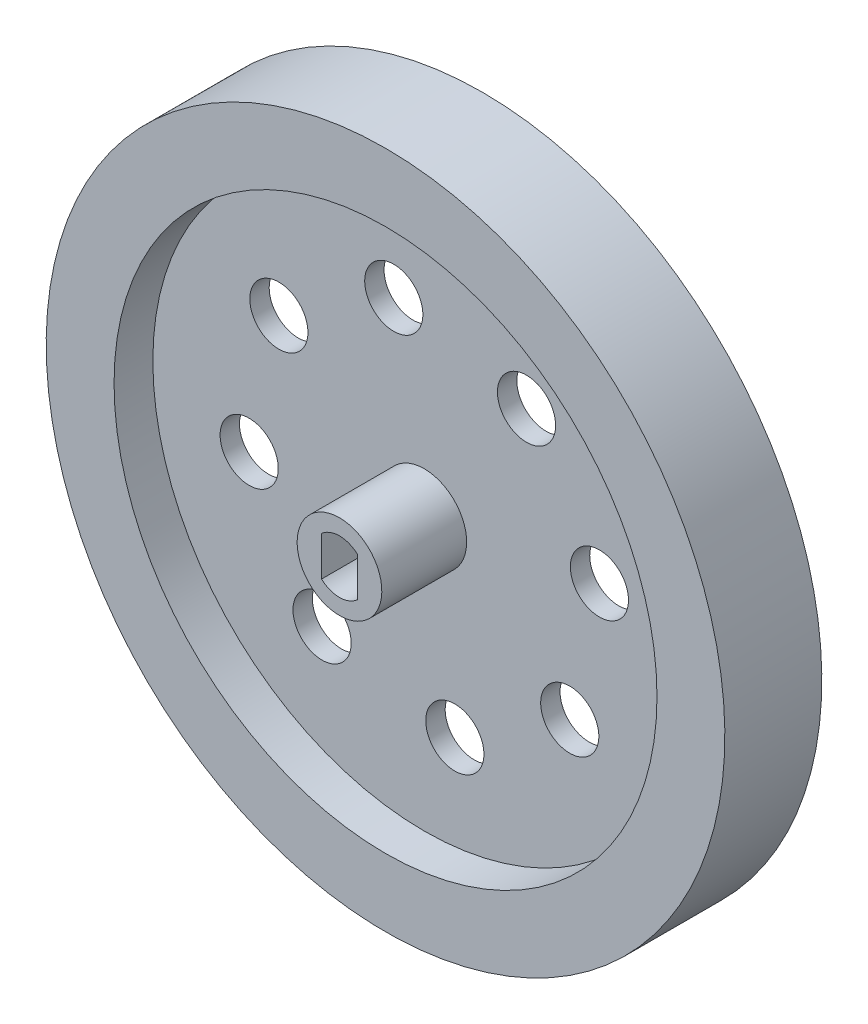
ISO-10303-21;
HEADER;
FILE_DESCRIPTION(('STEP AP214'),'2;1');
FILE_NAME('part.step','',(''),(''),'','','');
FILE_SCHEMA(('AUTOMOTIVE_DESIGN { 1 0 10303 214 1 1 1 1 }'));
ENDSEC;
DATA;
#1=APPLICATION_CONTEXT('core data for automotive mechanical design processes');
#2=APPLICATION_PROTOCOL_DEFINITION('international standard','automotive_design',2000,#1);
#3=PRODUCT_CONTEXT('',#1,'mechanical');
#4=PRODUCT('Part','Part','',(#3));
#5=PRODUCT_RELATED_PRODUCT_CATEGORY('part','',(#4));
#6=PRODUCT_DEFINITION_FORMATION('','',#4);
#7=PRODUCT_DEFINITION_CONTEXT('part definition',#1,'design');
#8=PRODUCT_DEFINITION('design','',#6,#7);
#9=PRODUCT_DEFINITION_SHAPE('','',#8);
#10=(LENGTH_UNIT() NAMED_UNIT(*) SI_UNIT(.MILLI.,.METRE.));
#11=(NAMED_UNIT(*) PLANE_ANGLE_UNIT() SI_UNIT($,.RADIAN.));
#12=(NAMED_UNIT(*) SI_UNIT($,.STERADIAN.) SOLID_ANGLE_UNIT());
#13=UNCERTAINTY_MEASURE_WITH_UNIT(LENGTH_MEASURE(1.E-05),#10,'distance_accuracy_value','');
#14=(GEOMETRIC_REPRESENTATION_CONTEXT(3) GLOBAL_UNCERTAINTY_ASSIGNED_CONTEXT((#13)) GLOBAL_UNIT_ASSIGNED_CONTEXT((#10,
#11,#12)) REPRESENTATION_CONTEXT('',''));
#15=CARTESIAN_POINT('',(0.,0.,0.));
#16=DIRECTION('',(0.,0.,1.));
#17=DIRECTION('',(1.,0.,0.));
#18=AXIS2_PLACEMENT_3D('',#15,#16,#17);
#19=CARTESIAN_POINT('',(0.,28.,-1.));
#20=DIRECTION('',(0.,0.,-1.));
#21=DIRECTION('',(0.,1.,0.));
#22=AXIS2_PLACEMENT_3D('',#19,#20,#21);
#23=PLANE('',#22);
#24=CARTESIAN_POINT('',(0.,0.,-1.));
#25=DIRECTION('',(0.,0.,-1.));
#26=DIRECTION('',(-1.,0.,0.));
#27=AXIS2_PLACEMENT_3D('',#24,#25,#26);
#28=CIRCLE('',#27,0.95);
#29=CARTESIAN_POINT('',(-0.95,0.,-1.));
#30=VERTEX_POINT('',#29);
#31=EDGE_CURVE('E200',#30,#30,#28,.T.);
#32=ORIENTED_EDGE('',*,*,#31,.F.);
#33=EDGE_LOOP('',(#32));
#34=FACE_BOUND('',#33,.T.);
#35=CARTESIAN_POINT('',(18.0622726774199,3.15093075817358,-1.));
#36=DIRECTION('',(0.,0.,-1.));
#37=DIRECTION('',(-1.,0.,0.));
#38=AXIS2_PLACEMENT_3D('',#35,#36,#37);
#39=CIRCLE('',#38,3.);
#40=CARTESIAN_POINT('',(15.0622726774199,3.15093075817358,-1.));
#41=VERTEX_POINT('',#40);
#42=EDGE_CURVE('E109',#41,#41,#39,.T.);
#43=ORIENTED_EDGE('',*,*,#42,.F.);
#44=EDGE_LOOP('',(#43));
#45=FACE_BOUND('',#44,.T.);
#46=CARTESIAN_POINT('',(14.9999999999965,-10.5439109876919,-1.));
#47=DIRECTION('',(0.,0.,-1.));
#48=DIRECTION('',(-1.,0.,0.));
#49=AXIS2_PLACEMENT_3D('',#46,#47,#48);
#50=CIRCLE('',#49,3.);
#51=CARTESIAN_POINT('',(11.9999999999965,-10.5439109876919,-1.));
#52=VERTEX_POINT('',#51);
#53=EDGE_CURVE('E113',#52,#52,#50,.T.);
#54=ORIENTED_EDGE('',*,*,#53,.F.);
#55=EDGE_LOOP('',(#54));
#56=FACE_BOUND('',#55,.T.);
#57=CARTESIAN_POINT('',(3.15093075817013,-18.0622726774216,-1.));
#58=DIRECTION('',(0.,0.,-1.));
#59=DIRECTION('',(-1.,0.,0.));
#60=AXIS2_PLACEMENT_3D('',#57,#58,#59);
#61=CIRCLE('',#60,3.);
#62=CARTESIAN_POINT('',(0.150930758170131,-18.0622726774216,-1.));
#63=VERTEX_POINT('',#62);
#64=EDGE_CURVE('E119',#63,#63,#61,.T.);
#65=ORIENTED_EDGE('',*,*,#64,.F.);
#66=EDGE_LOOP('',(#65));
#67=FACE_BOUND('',#66,.T.);
#68=CARTESIAN_POINT('',(-10.5439109876953,-14.9999999999982,-1.));
#69=DIRECTION('',(0.,0.,-1.));
#70=DIRECTION('',(-1.,0.,0.));
#71=AXIS2_PLACEMENT_3D('',#68,#69,#70);
#72=CIRCLE('',#71,3.);
#73=CARTESIAN_POINT('',(-13.5439109876953,-14.9999999999982,-1.));
#74=VERTEX_POINT('',#73);
#75=EDGE_CURVE('E125',#74,#74,#72,.T.);
#76=ORIENTED_EDGE('',*,*,#75,.F.);
#77=EDGE_LOOP('',(#76));
#78=FACE_BOUND('',#77,.T.);
#79=CARTESIAN_POINT('',(-18.062272677425,-3.15093075817182,-1.));
#80=DIRECTION('',(0.,0.,-1.));
#81=DIRECTION('',(-1.,0.,0.));
#82=AXIS2_PLACEMENT_3D('',#79,#80,#81);
#83=CIRCLE('',#82,3.);
#84=CARTESIAN_POINT('',(-21.062272677425,-3.15093075817182,-1.));
#85=VERTEX_POINT('',#84);
#86=EDGE_CURVE('E131',#85,#85,#83,.T.);
#87=ORIENTED_EDGE('',*,*,#86,.F.);
#88=EDGE_LOOP('',(#87));
#89=FACE_BOUND('',#88,.T.);
#90=CARTESIAN_POINT('',(-15.0000000000017,10.5439109876936,-1.));
#91=DIRECTION('',(0.,0.,-1.));
#92=DIRECTION('',(-1.,0.,0.));
#93=AXIS2_PLACEMENT_3D('',#90,#91,#92);
#94=CIRCLE('',#93,3.);
#95=CARTESIAN_POINT('',(-18.0000000000017,10.5439109876936,-1.));
#96=VERTEX_POINT('',#95);
#97=EDGE_CURVE('E137',#96,#96,#94,.T.);
#98=ORIENTED_EDGE('',*,*,#97,.F.);
#99=EDGE_LOOP('',(#98));
#100=FACE_BOUND('',#99,.T.);
#101=CARTESIAN_POINT('',(-3.15093075817527,18.0622726774234,-1.));
#102=DIRECTION('',(0.,0.,-1.));
#103=DIRECTION('',(-1.,0.,0.));
#104=AXIS2_PLACEMENT_3D('',#101,#102,#103);
#105=CIRCLE('',#104,3.);
#106=CARTESIAN_POINT('',(-6.15093075817527,18.0622726774234,-1.));
#107=VERTEX_POINT('',#106);
#108=EDGE_CURVE('E143',#107,#107,#105,.T.);
#109=ORIENTED_EDGE('',*,*,#108,.F.);
#110=EDGE_LOOP('',(#109));
#111=FACE_BOUND('',#110,.T.);
#112=CARTESIAN_POINT('',(10.5439109876902,15.,-1.));
#113=DIRECTION('',(0.,0.,-1.));
#114=DIRECTION('',(-1.,0.,0.));
#115=AXIS2_PLACEMENT_3D('',#112,#113,#114);
#116=CIRCLE('',#115,3.);
#117=CARTESIAN_POINT('',(7.54391098769017,15.,-1.));
#118=VERTEX_POINT('',#117);
#119=EDGE_CURVE('E149',#118,#118,#116,.T.);
#120=ORIENTED_EDGE('',*,*,#119,.F.);
#121=EDGE_LOOP('',(#120));
#122=FACE_BOUND('',#121,.T.);
#123=CARTESIAN_POINT('',(0.,0.,-1.));
#124=DIRECTION('',(0.,0.,-1.));
#125=DIRECTION('',(0.,1.,0.));
#126=AXIS2_PLACEMENT_3D('',#123,#124,#125);
#127=CIRCLE('',#126,28.);
#128=CARTESIAN_POINT('',(0.,28.,-0.999999999999999));
#129=VERTEX_POINT('',#128);
#130=EDGE_CURVE('E155',#129,#129,#127,.T.);
#131=ORIENTED_EDGE('',*,*,#130,.T.);
#132=EDGE_LOOP('',(#131));
#133=FACE_BOUND('',#132,.T.);
#134=ADVANCED_FACE('F34',(#34,#45,#56,#67,#78,#89,#100,#111,#122,#133),#23,.T.);
#135=CARTESIAN_POINT('',(0.,0.,9.75));
#136=DIRECTION('',(0.,0.,1.));
#137=DIRECTION('',(0.,-1.,0.));
#138=AXIS2_PLACEMENT_3D('',#135,#136,#137);
#139=PLANE('',#138);
#140=DIRECTION('',(0.,1.,0.));
#141=VECTOR('',#140,1.);
#142=CARTESIAN_POINT('',(1.85,-2.03469899493758,9.75));
#143=LINE('',#142,#141);
#144=CARTESIAN_POINT('',(1.85,-2.03469899493758,9.75));
#145=VERTEX_POINT('',#144);
#146=CARTESIAN_POINT('',(1.85,2.03469899493758,9.75));
#147=VERTEX_POINT('',#146);
#148=EDGE_CURVE('E90',#145,#147,#143,.T.);
#149=ORIENTED_EDGE('',*,*,#148,.F.);
#150=CARTESIAN_POINT('',(0.,0.,9.75));
#151=DIRECTION('',(0.,0.,1.));
#152=DIRECTION('',(1.,0.,0.));
#153=AXIS2_PLACEMENT_3D('',#150,#151,#152);
#154=CIRCLE('',#153,2.75);
#155=CARTESIAN_POINT('',(-1.85,-2.03469899493758,9.75));
#156=VERTEX_POINT('',#155);
#157=EDGE_CURVE('E100',#156,#145,#154,.T.);
#158=ORIENTED_EDGE('',*,*,#157,.F.);
#159=DIRECTION('',(0.,-1.,0.));
#160=VECTOR('',#159,1.);
#161=CARTESIAN_POINT('',(-1.85,-2.03469899493758,9.75));
#162=LINE('',#161,#160);
#163=CARTESIAN_POINT('',(-1.85,2.03469899493758,9.75));
#164=VERTEX_POINT('',#163);
#165=EDGE_CURVE('E48',#164,#156,#162,.T.);
#166=ORIENTED_EDGE('',*,*,#165,.F.);
#167=CARTESIAN_POINT('',(0.,0.,9.75));
#168=DIRECTION('',(0.,0.,1.));
#169=DIRECTION('',(1.,0.,0.));
#170=AXIS2_PLACEMENT_3D('',#167,#168,#169);
#171=CIRCLE('',#170,2.75);
#172=EDGE_CURVE('E96',#147,#164,#171,.T.);
#173=ORIENTED_EDGE('',*,*,#172,.F.);
#174=EDGE_LOOP('',(#149,#158,#166,#173));
#175=FACE_BOUND('',#174,.T.);
#176=CARTESIAN_POINT('',(0.,0.,9.75));
#177=DIRECTION('',(0.,0.,-1.));
#178=DIRECTION('',(0.,1.,0.));
#179=AXIS2_PLACEMENT_3D('',#176,#177,#178);
#180=CIRCLE('',#179,4.36729935384506);
#181=CARTESIAN_POINT('',(0.,4.36729935384506,9.75));
#182=VERTEX_POINT('',#181);
#183=EDGE_CURVE('E12',#182,#182,#180,.T.);
#184=ORIENTED_EDGE('',*,*,#183,.F.);
#185=EDGE_LOOP('',(#184));
#186=FACE_BOUND('',#185,.T.);
#187=ADVANCED_FACE('F182',(#175,#186),#139,.T.);
#188=CARTESIAN_POINT('',(0.,0.,0.));
#189=DIRECTION('',(0.,0.,-1.));
#190=DIRECTION('',(0.,1.,0.));
#191=AXIS2_PLACEMENT_3D('',#188,#189,#190);
#192=CYLINDRICAL_SURFACE('',#191,4.36729935384506);
#193=ORIENTED_EDGE('',*,*,#183,.T.);
#194=EDGE_LOOP('',(#193));
#195=FACE_BOUND('',#194,.T.);
#196=CARTESIAN_POINT('',(0.,0.,1.));
#197=DIRECTION('',(0.,0.,-1.));
#198=DIRECTION('',(0.,1.,0.));
#199=AXIS2_PLACEMENT_3D('',#196,#197,#198);
#200=CIRCLE('',#199,4.36729935384506);
#201=CARTESIAN_POINT('',(0.,4.36729935384506,1.));
#202=VERTEX_POINT('',#201);
#203=EDGE_CURVE('E41',#202,#202,#200,.T.);
#204=ORIENTED_EDGE('',*,*,#203,.F.);
#205=EDGE_LOOP('',(#204));
#206=FACE_BOUND('',#205,.T.);
#207=ADVANCED_FACE('F180',(#195,#206),#192,.T.);
#208=CARTESIAN_POINT('',(0.,4.36729935384506,0.999999999999999));
#209=DIRECTION('',(0.,0.,1.));
#210=DIRECTION('',(0.,-1.,0.));
#211=AXIS2_PLACEMENT_3D('',#208,#209,#210);
#212=PLANE('',#211);
#213=CARTESIAN_POINT('',(18.0622726774199,3.15093075817358,0.999999999999995));
#214=DIRECTION('',(0.,0.,-1.));
#215=DIRECTION('',(-1.,0.,0.));
#216=AXIS2_PLACEMENT_3D('',#213,#214,#215);
#217=CIRCLE('',#216,3.);
#218=CARTESIAN_POINT('',(15.0622726774199,3.15093075817358,0.999999999999995));
#219=VERTEX_POINT('',#218);
#220=EDGE_CURVE('E110',#219,#219,#217,.T.);
#221=ORIENTED_EDGE('',*,*,#220,.T.);
#222=EDGE_LOOP('',(#221));
#223=FACE_BOUND('',#222,.T.);
#224=CARTESIAN_POINT('',(14.9999999999965,-10.5439109876919,0.999999999999995));
#225=DIRECTION('',(0.,0.,-1.));
#226=DIRECTION('',(-1.,0.,0.));
#227=AXIS2_PLACEMENT_3D('',#224,#225,#226);
#228=CIRCLE('',#227,3.);
#229=CARTESIAN_POINT('',(11.9999999999965,-10.5439109876919,0.999999999999995));
#230=VERTEX_POINT('',#229);
#231=EDGE_CURVE('E116',#230,#230,#228,.T.);
#232=ORIENTED_EDGE('',*,*,#231,.T.);
#233=EDGE_LOOP('',(#232));
#234=FACE_BOUND('',#233,.T.);
#235=CARTESIAN_POINT('',(3.15093075817013,-18.0622726774216,0.999999999999995));
#236=DIRECTION('',(0.,0.,-1.));
#237=DIRECTION('',(-1.,0.,0.));
#238=AXIS2_PLACEMENT_3D('',#235,#236,#237);
#239=CIRCLE('',#238,3.);
#240=CARTESIAN_POINT('',(0.150930758170131,-18.0622726774216,0.999999999999995));
#241=VERTEX_POINT('',#240);
#242=EDGE_CURVE('E122',#241,#241,#239,.T.);
#243=ORIENTED_EDGE('',*,*,#242,.T.);
#244=EDGE_LOOP('',(#243));
#245=FACE_BOUND('',#244,.T.);
#246=CARTESIAN_POINT('',(-10.5439109876953,-14.9999999999982,0.999999999999995));
#247=DIRECTION('',(0.,0.,-1.));
#248=DIRECTION('',(-1.,0.,0.));
#249=AXIS2_PLACEMENT_3D('',#246,#247,#248);
#250=CIRCLE('',#249,3.);
#251=CARTESIAN_POINT('',(-13.5439109876953,-14.9999999999982,0.999999999999995));
#252=VERTEX_POINT('',#251);
#253=EDGE_CURVE('E128',#252,#252,#250,.T.);
#254=ORIENTED_EDGE('',*,*,#253,.T.);
#255=EDGE_LOOP('',(#254));
#256=FACE_BOUND('',#255,.T.);
#257=CARTESIAN_POINT('',(-18.062272677425,-3.15093075817182,0.999999999999995));
#258=DIRECTION('',(0.,0.,-1.));
#259=DIRECTION('',(-1.,0.,0.));
#260=AXIS2_PLACEMENT_3D('',#257,#258,#259);
#261=CIRCLE('',#260,3.);
#262=CARTESIAN_POINT('',(-21.062272677425,-3.15093075817182,0.999999999999995));
#263=VERTEX_POINT('',#262);
#264=EDGE_CURVE('E134',#263,#263,#261,.T.);
#265=ORIENTED_EDGE('',*,*,#264,.T.);
#266=EDGE_LOOP('',(#265));
#267=FACE_BOUND('',#266,.T.);
#268=CARTESIAN_POINT('',(-15.0000000000017,10.5439109876936,0.999999999999995));
#269=DIRECTION('',(0.,0.,-1.));
#270=DIRECTION('',(-1.,0.,0.));
#271=AXIS2_PLACEMENT_3D('',#268,#269,#270);
#272=CIRCLE('',#271,3.);
#273=CARTESIAN_POINT('',(-18.0000000000017,10.5439109876936,0.999999999999995));
#274=VERTEX_POINT('',#273);
#275=EDGE_CURVE('E140',#274,#274,#272,.T.);
#276=ORIENTED_EDGE('',*,*,#275,.T.);
#277=EDGE_LOOP('',(#276));
#278=FACE_BOUND('',#277,.T.);
#279=CARTESIAN_POINT('',(-3.15093075817527,18.0622726774234,0.999999999999995));
#280=DIRECTION('',(0.,0.,-1.));
#281=DIRECTION('',(-1.,0.,0.));
#282=AXIS2_PLACEMENT_3D('',#279,#280,#281);
#283=CIRCLE('',#282,3.);
#284=CARTESIAN_POINT('',(-6.15093075817527,18.0622726774234,0.999999999999995));
#285=VERTEX_POINT('',#284);
#286=EDGE_CURVE('E146',#285,#285,#283,.T.);
#287=ORIENTED_EDGE('',*,*,#286,.T.);
#288=EDGE_LOOP('',(#287));
#289=FACE_BOUND('',#288,.T.);
#290=CARTESIAN_POINT('',(10.5439109876902,15.,0.999999999999995));
#291=DIRECTION('',(0.,0.,-1.));
#292=DIRECTION('',(-1.,0.,0.));
#293=AXIS2_PLACEMENT_3D('',#290,#291,#292);
#294=CIRCLE('',#293,3.);
#295=CARTESIAN_POINT('',(7.54391098769017,15.,0.999999999999995));
#296=VERTEX_POINT('',#295);
#297=EDGE_CURVE('E152',#296,#296,#294,.T.);
#298=ORIENTED_EDGE('',*,*,#297,.T.);
#299=EDGE_LOOP('',(#298));
#300=FACE_BOUND('',#299,.T.);
#301=ORIENTED_EDGE('',*,*,#203,.T.);
#302=EDGE_LOOP('',(#301));
#303=FACE_BOUND('',#302,.T.);
#304=CARTESIAN_POINT('',(0.,0.,0.999999999999996));
#305=DIRECTION('',(0.,0.,-1.));
#306=DIRECTION('',(0.,1.,0.));
#307=AXIS2_PLACEMENT_3D('',#304,#305,#306);
#308=CIRCLE('',#307,28.);
#309=CARTESIAN_POINT('',(0.,28.,0.999999999999999));
#310=VERTEX_POINT('',#309);
#311=EDGE_CURVE('E172',#310,#310,#308,.T.);
#312=ORIENTED_EDGE('',*,*,#311,.F.);
#313=EDGE_LOOP('',(#312));
#314=FACE_BOUND('',#313,.T.);
#315=ADVANCED_FACE('F177',(#223,#234,#245,#256,#267,#278,#289,#300,#303,#314),#212,.T.);
#316=CARTESIAN_POINT('',(0.,0.,0.));
#317=DIRECTION('',(0.,0.,-1.));
#318=DIRECTION('',(0.,1.,0.));
#319=AXIS2_PLACEMENT_3D('',#316,#317,#318);
#320=CYLINDRICAL_SURFACE('',#319,28.);
#321=ORIENTED_EDGE('',*,*,#311,.T.);
#322=EDGE_LOOP('',(#321));
#323=FACE_BOUND('',#322,.T.);
#324=CARTESIAN_POINT('',(0.,0.,5.));
#325=DIRECTION('',(0.,0.,-1.));
#326=DIRECTION('',(0.,1.,0.));
#327=AXIS2_PLACEMENT_3D('',#324,#325,#326);
#328=CIRCLE('',#327,28.);
#329=CARTESIAN_POINT('',(0.,28.,5.));
#330=VERTEX_POINT('',#329);
#331=EDGE_CURVE('E169',#330,#330,#328,.T.);
#332=ORIENTED_EDGE('',*,*,#331,.F.);
#333=EDGE_LOOP('',(#332));
#334=FACE_BOUND('',#333,.T.);
#335=ADVANCED_FACE('F189',(#323,#334),#320,.F.);
#336=CARTESIAN_POINT('',(0.,28.,5.));
#337=DIRECTION('',(0.,0.,1.));
#338=DIRECTION('',(0.,-1.,0.));
#339=AXIS2_PLACEMENT_3D('',#336,#337,#338);
#340=PLANE('',#339);
#341=ORIENTED_EDGE('',*,*,#331,.T.);
#342=EDGE_LOOP('',(#341));
#343=FACE_BOUND('',#342,.T.);
#344=CARTESIAN_POINT('',(0.,0.,5.));
#345=DIRECTION('',(0.,0.,-1.));
#346=DIRECTION('',(0.,1.,0.));
#347=AXIS2_PLACEMENT_3D('',#344,#345,#346);
#348=CIRCLE('',#347,35.);
#349=CARTESIAN_POINT('',(0.,35.,5.));
#350=VERTEX_POINT('',#349);
#351=EDGE_CURVE('E166',#350,#350,#348,.T.);
#352=ORIENTED_EDGE('',*,*,#351,.F.);
#353=EDGE_LOOP('',(#352));
#354=FACE_BOUND('',#353,.T.);
#355=ADVANCED_FACE('F239',(#343,#354),#340,.T.);
#356=CARTESIAN_POINT('',(0.,0.,0.));
#357=DIRECTION('',(0.,0.,-1.));
#358=DIRECTION('',(0.,1.,0.));
#359=AXIS2_PLACEMENT_3D('',#356,#357,#358);
#360=CYLINDRICAL_SURFACE('',#359,35.);
#361=ORIENTED_EDGE('',*,*,#351,.T.);
#362=EDGE_LOOP('',(#361));
#363=FACE_BOUND('',#362,.T.);
#364=CARTESIAN_POINT('',(0.,0.,-5.));
#365=DIRECTION('',(0.,0.,-1.));
#366=DIRECTION('',(0.,1.,0.));
#367=AXIS2_PLACEMENT_3D('',#364,#365,#366);
#368=CIRCLE('',#367,35.);
#369=CARTESIAN_POINT('',(0.,35.,-5.));
#370=VERTEX_POINT('',#369);
#371=EDGE_CURVE('E163',#370,#370,#368,.T.);
#372=ORIENTED_EDGE('',*,*,#371,.F.);
#373=EDGE_LOOP('',(#372));
#374=FACE_BOUND('',#373,.T.);
#375=ADVANCED_FACE('F232',(#363,#374),#360,.T.);
#376=CARTESIAN_POINT('',(0.,28.,-5.));
#377=DIRECTION('',(0.,0.,-1.));
#378=DIRECTION('',(0.,1.,0.));
#379=AXIS2_PLACEMENT_3D('',#376,#377,#378);
#380=PLANE('',#379);
#381=ORIENTED_EDGE('',*,*,#371,.T.);
#382=EDGE_LOOP('',(#381));
#383=FACE_BOUND('',#382,.T.);
#384=CARTESIAN_POINT('',(0.,0.,-5.));
#385=DIRECTION('',(0.,0.,-1.));
#386=DIRECTION('',(0.,1.,0.));
#387=AXIS2_PLACEMENT_3D('',#384,#385,#386);
#388=CIRCLE('',#387,28.);
#389=CARTESIAN_POINT('',(0.,28.,-5.));
#390=VERTEX_POINT('',#389);
#391=EDGE_CURVE('E160',#390,#390,#388,.T.);
#392=ORIENTED_EDGE('',*,*,#391,.F.);
#393=EDGE_LOOP('',(#392));
#394=FACE_BOUND('',#393,.T.);
#395=ADVANCED_FACE('F222',(#383,#394),#380,.T.);
#396=CARTESIAN_POINT('',(0.,0.,0.));
#397=DIRECTION('',(0.,0.,-1.));
#398=DIRECTION('',(0.,1.,0.));
#399=AXIS2_PLACEMENT_3D('',#396,#397,#398);
#400=CYLINDRICAL_SURFACE('',#399,28.);
#401=ORIENTED_EDGE('',*,*,#391,.T.);
#402=EDGE_LOOP('',(#401));
#403=FACE_BOUND('',#402,.T.);
#404=ORIENTED_EDGE('',*,*,#130,.F.);
#405=EDGE_LOOP('',(#404));
#406=FACE_BOUND('',#405,.T.);
#407=ADVANCED_FACE('F219',(#403,#406),#400,.F.);
#408=CARTESIAN_POINT('',(10.5439109876902,15.,0.999999999999995));
#409=DIRECTION('',(0.,0.,-1.));
#410=DIRECTION('',(-1.,0.,0.));
#411=AXIS2_PLACEMENT_3D('',#408,#409,#410);
#412=CYLINDRICAL_SURFACE('',#411,3.);
#413=ORIENTED_EDGE('',*,*,#297,.F.);
#414=EDGE_LOOP('',(#413));
#415=FACE_BOUND('',#414,.T.);
#416=ORIENTED_EDGE('',*,*,#119,.T.);
#417=EDGE_LOOP('',(#416));
#418=FACE_BOUND('',#417,.T.);
#419=ADVANCED_FACE('F221',(#415,#418),#412,.F.);
#420=CARTESIAN_POINT('',(-3.15093075817527,18.0622726774234,0.999999999999995));
#421=DIRECTION('',(0.,0.,-1.));
#422=DIRECTION('',(-1.,0.,0.));
#423=AXIS2_PLACEMENT_3D('',#420,#421,#422);
#424=CYLINDRICAL_SURFACE('',#423,3.);
#425=ORIENTED_EDGE('',*,*,#286,.F.);
#426=EDGE_LOOP('',(#425));
#427=FACE_BOUND('',#426,.T.);
#428=ORIENTED_EDGE('',*,*,#108,.T.);
#429=EDGE_LOOP('',(#428));
#430=FACE_BOUND('',#429,.T.);
#431=ADVANCED_FACE('F229',(#427,#430),#424,.F.);
#432=CARTESIAN_POINT('',(-15.0000000000017,10.5439109876936,0.999999999999995));
#433=DIRECTION('',(0.,0.,-1.));
#434=DIRECTION('',(-1.,0.,0.));
#435=AXIS2_PLACEMENT_3D('',#432,#433,#434);
#436=CYLINDRICAL_SURFACE('',#435,3.);
#437=ORIENTED_EDGE('',*,*,#275,.F.);
#438=EDGE_LOOP('',(#437));
#439=FACE_BOUND('',#438,.T.);
#440=ORIENTED_EDGE('',*,*,#97,.T.);
#441=EDGE_LOOP('',(#440));
#442=FACE_BOUND('',#441,.T.);
#443=ADVANCED_FACE('F295',(#439,#442),#436,.F.);
#444=CARTESIAN_POINT('',(-18.062272677425,-3.15093075817182,0.999999999999995));
#445=DIRECTION('',(0.,0.,-1.));
#446=DIRECTION('',(-1.,0.,0.));
#447=AXIS2_PLACEMENT_3D('',#444,#445,#446);
#448=CYLINDRICAL_SURFACE('',#447,3.);
#449=ORIENTED_EDGE('',*,*,#264,.F.);
#450=EDGE_LOOP('',(#449));
#451=FACE_BOUND('',#450,.T.);
#452=ORIENTED_EDGE('',*,*,#86,.T.);
#453=EDGE_LOOP('',(#452));
#454=FACE_BOUND('',#453,.T.);
#455=ADVANCED_FACE('F304',(#451,#454),#448,.F.);
#456=CARTESIAN_POINT('',(-10.5439109876953,-14.9999999999982,0.999999999999995));
#457=DIRECTION('',(0.,0.,-1.));
#458=DIRECTION('',(-1.,0.,0.));
#459=AXIS2_PLACEMENT_3D('',#456,#457,#458);
#460=CYLINDRICAL_SURFACE('',#459,3.);
#461=ORIENTED_EDGE('',*,*,#253,.F.);
#462=EDGE_LOOP('',(#461));
#463=FACE_BOUND('',#462,.T.);
#464=ORIENTED_EDGE('',*,*,#75,.T.);
#465=EDGE_LOOP('',(#464));
#466=FACE_BOUND('',#465,.T.);
#467=ADVANCED_FACE('F314',(#463,#466),#460,.F.);
#468=CARTESIAN_POINT('',(3.15093075817013,-18.0622726774216,0.999999999999995));
#469=DIRECTION('',(0.,0.,-1.));
#470=DIRECTION('',(-1.,0.,0.));
#471=AXIS2_PLACEMENT_3D('',#468,#469,#470);
#472=CYLINDRICAL_SURFACE('',#471,3.);
#473=ORIENTED_EDGE('',*,*,#242,.F.);
#474=EDGE_LOOP('',(#473));
#475=FACE_BOUND('',#474,.T.);
#476=ORIENTED_EDGE('',*,*,#64,.T.);
#477=EDGE_LOOP('',(#476));
#478=FACE_BOUND('',#477,.T.);
#479=ADVANCED_FACE('F324',(#475,#478),#472,.F.);
#480=CARTESIAN_POINT('',(14.9999999999965,-10.5439109876919,0.999999999999995));
#481=DIRECTION('',(0.,0.,-1.));
#482=DIRECTION('',(-1.,0.,0.));
#483=AXIS2_PLACEMENT_3D('',#480,#481,#482);
#484=CYLINDRICAL_SURFACE('',#483,3.);
#485=ORIENTED_EDGE('',*,*,#231,.F.);
#486=EDGE_LOOP('',(#485));
#487=FACE_BOUND('',#486,.T.);
#488=ORIENTED_EDGE('',*,*,#53,.T.);
#489=EDGE_LOOP('',(#488));
#490=FACE_BOUND('',#489,.T.);
#491=ADVANCED_FACE('F334',(#487,#490),#484,.F.);
#492=CARTESIAN_POINT('',(18.0622726774199,3.15093075817358,0.999999999999995));
#493=DIRECTION('',(0.,0.,-1.));
#494=DIRECTION('',(-1.,0.,0.));
#495=AXIS2_PLACEMENT_3D('',#492,#493,#494);
#496=CYLINDRICAL_SURFACE('',#495,3.);
#497=ORIENTED_EDGE('',*,*,#220,.F.);
#498=EDGE_LOOP('',(#497));
#499=FACE_BOUND('',#498,.T.);
#500=ORIENTED_EDGE('',*,*,#42,.T.);
#501=EDGE_LOOP('',(#500));
#502=FACE_BOUND('',#501,.T.);
#503=ADVANCED_FACE('F344',(#499,#502),#496,.F.);
#504=CARTESIAN_POINT('',(0.,28.,0.999999999999999));
#505=DIRECTION('',(0.,0.,-1.));
#506=DIRECTION('',(0.,1.,0.));
#507=AXIS2_PLACEMENT_3D('',#504,#505,#506);
#508=PLANE('',#507);
#509=CARTESIAN_POINT('',(0.,0.,0.999999999999995));
#510=DIRECTION('',(0.,0.,-1.));
#511=DIRECTION('',(-1.,0.,0.));
#512=AXIS2_PLACEMENT_3D('',#509,#510,#511);
#513=CIRCLE('',#512,0.95);
#514=CARTESIAN_POINT('',(-0.95,0.,0.999999999999995));
#515=VERTEX_POINT('',#514);
#516=EDGE_CURVE('E425',#515,#515,#513,.T.);
#517=ORIENTED_EDGE('',*,*,#516,.T.);
#518=EDGE_LOOP('',(#517));
#519=FACE_BOUND('',#518,.T.);
#520=CARTESIAN_POINT('',(0.,0.,0.999999999999996));
#521=DIRECTION('',(0.,0.,-1.));
#522=DIRECTION('',(0.,1.,0.));
#523=AXIS2_PLACEMENT_3D('',#520,#521,#522);
#524=CIRCLE('',#523,2.75);
#525=CARTESIAN_POINT('',(-1.85,-2.03469899493758,0.999999999999996));
#526=VERTEX_POINT('',#525);
#527=CARTESIAN_POINT('',(1.85,-2.03469899493758,0.999999999999996));
#528=VERTEX_POINT('',#527);
#529=EDGE_CURVE('E94',#526,#528,#524,.F.);
#530=ORIENTED_EDGE('',*,*,#529,.T.);
#531=DIRECTION('',(0.,1.,0.));
#532=VECTOR('',#531,1.);
#533=CARTESIAN_POINT('',(1.85,-2.03469899493758,0.999999999999996));
#534=LINE('',#533,#532);
#535=CARTESIAN_POINT('',(1.85,2.03469899493758,0.999999999999996));
#536=VERTEX_POINT('',#535);
#537=EDGE_CURVE('E72',#528,#536,#534,.T.);
#538=ORIENTED_EDGE('',*,*,#537,.T.);
#539=CARTESIAN_POINT('',(0.,0.,0.999999999999996));
#540=DIRECTION('',(0.,0.,-1.));
#541=DIRECTION('',(0.,1.,0.));
#542=AXIS2_PLACEMENT_3D('',#539,#540,#541);
#543=CIRCLE('',#542,2.75);
#544=CARTESIAN_POINT('',(-1.85,2.03469899493758,0.999999999999996));
#545=VERTEX_POINT('',#544);
#546=EDGE_CURVE('E80',#536,#545,#543,.F.);
#547=ORIENTED_EDGE('',*,*,#546,.T.);
#548=DIRECTION('',(0.,-1.,0.));
#549=VECTOR('',#548,1.);
#550=CARTESIAN_POINT('',(-1.85,-2.03469899493758,0.999999999999996));
#551=LINE('',#550,#549);
#552=EDGE_CURVE('E104',#545,#526,#551,.T.);
#553=ORIENTED_EDGE('',*,*,#552,.T.);
#554=EDGE_LOOP('',(#530,#538,#547,#553));
#555=FACE_BOUND('',#554,.T.);
#556=ADVANCED_FACE('F93',(#519,#555),#508,.F.);
#557=CARTESIAN_POINT('',(1.85,-2.03469899493758,-7.62872536767063));
#558=DIRECTION('',(1.,0.,0.));
#559=DIRECTION('',(0.,0.,-1.));
#560=AXIS2_PLACEMENT_3D('',#557,#558,#559);
#561=PLANE('',#560);
#562=DIRECTION('',(0.,0.,1.));
#563=VECTOR('',#562,1.);
#564=CARTESIAN_POINT('',(1.85,-2.03469899493758,-7.62872536767063));
#565=LINE('',#564,#563);
#566=EDGE_CURVE('E57',#528,#145,#565,.T.);
#567=ORIENTED_EDGE('',*,*,#566,.T.);
#568=ORIENTED_EDGE('',*,*,#148,.T.);
#569=DIRECTION('',(0.,0.,1.));
#570=VECTOR('',#569,1.);
#571=CARTESIAN_POINT('',(1.85,2.03469899493758,-7.62872536767063));
#572=LINE('',#571,#570);
#573=EDGE_CURVE('E83',#536,#147,#572,.T.);
#574=ORIENTED_EDGE('',*,*,#573,.F.);
#575=ORIENTED_EDGE('',*,*,#537,.F.);
#576=EDGE_LOOP('',(#567,#568,#574,#575));
#577=FACE_BOUND('',#576,.T.);
#578=ADVANCED_FACE('F88',(#577),#561,.F.);
#579=CARTESIAN_POINT('',(0.,0.,-7.62872536767063));
#580=DIRECTION('',(0.,0.,1.));
#581=DIRECTION('',(1.,0.,0.));
#582=AXIS2_PLACEMENT_3D('',#579,#580,#581);
#583=CYLINDRICAL_SURFACE('',#582,2.75);
#584=ORIENTED_EDGE('',*,*,#573,.T.);
#585=ORIENTED_EDGE('',*,*,#172,.T.);
#586=DIRECTION('',(0.,0.,1.));
#587=VECTOR('',#586,1.);
#588=CARTESIAN_POINT('',(-1.85,2.03469899493758,-7.62872536767063));
#589=LINE('',#588,#587);
#590=EDGE_CURVE('E84',#545,#164,#589,.T.);
#591=ORIENTED_EDGE('',*,*,#590,.F.);
#592=ORIENTED_EDGE('',*,*,#546,.F.);
#593=EDGE_LOOP('',(#584,#585,#591,#592));
#594=FACE_BOUND('',#593,.T.);
#595=ADVANCED_FACE('F81',(#594),#583,.F.);
#596=CARTESIAN_POINT('',(-1.85,-2.03469899493758,-7.62872536767063));
#597=DIRECTION('',(-1.,0.,0.));
#598=DIRECTION('',(0.,0.,1.));
#599=AXIS2_PLACEMENT_3D('',#596,#597,#598);
#600=PLANE('',#599);
#601=ORIENTED_EDGE('',*,*,#590,.T.);
#602=ORIENTED_EDGE('',*,*,#165,.T.);
#603=DIRECTION('',(0.,0.,1.));
#604=VECTOR('',#603,1.);
#605=CARTESIAN_POINT('',(-1.85,-2.03469899493758,-7.62872536767063));
#606=LINE('',#605,#604);
#607=EDGE_CURVE('E103',#526,#156,#606,.T.);
#608=ORIENTED_EDGE('',*,*,#607,.F.);
#609=ORIENTED_EDGE('',*,*,#552,.F.);
#610=EDGE_LOOP('',(#601,#602,#608,#609));
#611=FACE_BOUND('',#610,.T.);
#612=ADVANCED_FACE('F380',(#611),#600,.F.);
#613=CARTESIAN_POINT('',(0.,0.,-7.62872536767063));
#614=DIRECTION('',(0.,0.,1.));
#615=DIRECTION('',(1.,0.,0.));
#616=AXIS2_PLACEMENT_3D('',#613,#614,#615);
#617=CYLINDRICAL_SURFACE('',#616,2.75);
#618=ORIENTED_EDGE('',*,*,#607,.T.);
#619=ORIENTED_EDGE('',*,*,#157,.T.);
#620=ORIENTED_EDGE('',*,*,#566,.F.);
#621=ORIENTED_EDGE('',*,*,#529,.F.);
#622=EDGE_LOOP('',(#618,#619,#620,#621));
#623=FACE_BOUND('',#622,.T.);
#624=ADVANCED_FACE('F389',(#623),#617,.F.);
#625=CARTESIAN_POINT('',(0.,0.,0.999999999999995));
#626=DIRECTION('',(0.,0.,-1.));
#627=DIRECTION('',(-1.,0.,0.));
#628=AXIS2_PLACEMENT_3D('',#625,#626,#627);
#629=CYLINDRICAL_SURFACE('',#628,0.95);
#630=ORIENTED_EDGE('',*,*,#516,.F.);
#631=EDGE_LOOP('',(#630));
#632=FACE_BOUND('',#631,.T.);
#633=ORIENTED_EDGE('',*,*,#31,.T.);
#634=EDGE_LOOP('',(#633));
#635=FACE_BOUND('',#634,.T.);
#636=ADVANCED_FACE('F397',(#632,#635),#629,.F.);
#637=CLOSED_SHELL('',(#134,#187,#207,#315,#335,#355,#375,#395,#407,#419,#431,#443,#455,#467,
#479,#491,#503,#556,#578,#595,#612,#624,#636));
#638=MANIFOLD_SOLID_BREP('B2',#637);
#639=ADVANCED_BREP_SHAPE_REPRESENTATION('',(#18,#638),#14);
#640=SHAPE_DEFINITION_REPRESENTATION(#9,#639);
ENDSEC;
END-ISO-10303-21;
